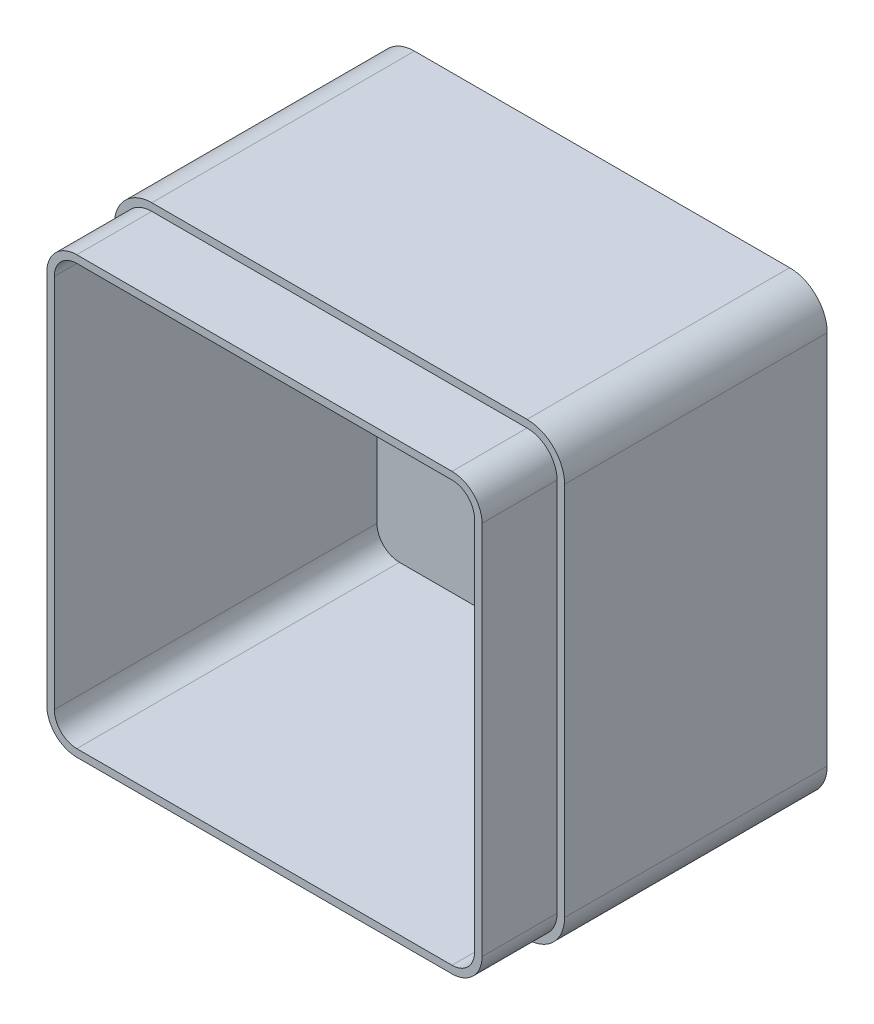
ISO-10303-21;
HEADER;
FILE_DESCRIPTION(('STEP AP214'),'2;1');
FILE_NAME('part.step','',(''),(''),'','','');
FILE_SCHEMA(('AUTOMOTIVE_DESIGN { 1 0 10303 214 1 1 1 1 }'));
ENDSEC;
DATA;
#1=APPLICATION_CONTEXT('core data for automotive mechanical design processes');
#2=APPLICATION_PROTOCOL_DEFINITION('international standard','automotive_design',2000,#1);
#3=PRODUCT_CONTEXT('',#1,'mechanical');
#4=PRODUCT('Part','Part','',(#3));
#5=PRODUCT_RELATED_PRODUCT_CATEGORY('part','',(#4));
#6=PRODUCT_DEFINITION_FORMATION('','',#4);
#7=PRODUCT_DEFINITION_CONTEXT('part definition',#1,'design');
#8=PRODUCT_DEFINITION('design','',#6,#7);
#9=PRODUCT_DEFINITION_SHAPE('','',#8);
#10=(LENGTH_UNIT() NAMED_UNIT(*) SI_UNIT(.MILLI.,.METRE.));
#11=(NAMED_UNIT(*) PLANE_ANGLE_UNIT() SI_UNIT($,.RADIAN.));
#12=(NAMED_UNIT(*) SI_UNIT($,.STERADIAN.) SOLID_ANGLE_UNIT());
#13=UNCERTAINTY_MEASURE_WITH_UNIT(LENGTH_MEASURE(1.E-05),#10,'distance_accuracy_value','');
#14=(GEOMETRIC_REPRESENTATION_CONTEXT(3) GLOBAL_UNCERTAINTY_ASSIGNED_CONTEXT((#13)) GLOBAL_UNIT_ASSIGNED_CONTEXT((#10,
#11,#12)) REPRESENTATION_CONTEXT('',''));
#15=CARTESIAN_POINT('',(0.,0.,0.));
#16=DIRECTION('',(0.,0.,1.));
#17=DIRECTION('',(1.,0.,0.));
#18=AXIS2_PLACEMENT_3D('',#15,#16,#17);
#19=CARTESIAN_POINT('',(0.,0.,90.));
#20=DIRECTION('',(0.,0.,1.));
#21=DIRECTION('',(1.,0.,0.));
#22=AXIS2_PLACEMENT_3D('',#19,#20,#21);
#23=PLANE('',#22);
#24=DIRECTION('',(0.,-1.,0.));
#25=VECTOR('',#24,1.);
#26=CARTESIAN_POINT('',(4.,0.,90.));
#27=LINE('',#26,#25);
#28=CARTESIAN_POINT('',(4.,-10.,90.));
#29=VERTEX_POINT('',#28);
#30=CARTESIAN_POINT('',(4.00000000000001,-110.,90.));
#31=VERTEX_POINT('',#30);
#32=EDGE_CURVE('E350',#29,#31,#27,.T.);
#33=ORIENTED_EDGE('',*,*,#32,.F.);
#34=CARTESIAN_POINT('',(10.,-10.,90.));
#35=DIRECTION('',(0.,0.,1.));
#36=DIRECTION('',(1.,0.,0.));
#37=AXIS2_PLACEMENT_3D('',#34,#35,#36);
#38=CIRCLE('',#37,6.);
#39=CARTESIAN_POINT('',(9.99999999999999,-4.,90.));
#40=VERTEX_POINT('',#39);
#41=EDGE_CURVE('E328',#40,#29,#38,.T.);
#42=ORIENTED_EDGE('',*,*,#41,.F.);
#43=DIRECTION('',(-1.,0.,0.));
#44=VECTOR('',#43,1.);
#45=CARTESIAN_POINT('',(0.,-4.,90.));
#46=LINE('',#45,#44);
#47=CARTESIAN_POINT('',(110.,-4.,90.));
#48=VERTEX_POINT('',#47);
#49=EDGE_CURVE('E364',#48,#40,#46,.T.);
#50=ORIENTED_EDGE('',*,*,#49,.F.);
#51=CARTESIAN_POINT('',(110.,-10.,90.));
#52=DIRECTION('',(0.,0.,1.));
#53=DIRECTION('',(1.,0.,0.));
#54=AXIS2_PLACEMENT_3D('',#51,#52,#53);
#55=CIRCLE('',#54,6.);
#56=CARTESIAN_POINT('',(116.,-9.99999999999999,90.));
#57=VERTEX_POINT('',#56);
#58=EDGE_CURVE('E395',#57,#48,#55,.T.);
#59=ORIENTED_EDGE('',*,*,#58,.F.);
#60=DIRECTION('',(0.,1.,0.));
#61=VECTOR('',#60,1.);
#62=CARTESIAN_POINT('',(116.,0.,90.));
#63=LINE('',#62,#61);
#64=CARTESIAN_POINT('',(116.,-110.,90.));
#65=VERTEX_POINT('',#64);
#66=EDGE_CURVE('E392',#65,#57,#63,.T.);
#67=ORIENTED_EDGE('',*,*,#66,.F.);
#68=CARTESIAN_POINT('',(110.,-110.,90.));
#69=DIRECTION('',(0.,0.,1.));
#70=DIRECTION('',(1.,0.,0.));
#71=AXIS2_PLACEMENT_3D('',#68,#69,#70);
#72=CIRCLE('',#71,6.);
#73=CARTESIAN_POINT('',(110.,-116.,90.));
#74=VERTEX_POINT('',#73);
#75=EDGE_CURVE('E388',#74,#65,#72,.T.);
#76=ORIENTED_EDGE('',*,*,#75,.F.);
#77=DIRECTION('',(1.,0.,0.));
#78=VECTOR('',#77,1.);
#79=CARTESIAN_POINT('',(0.,-116.,90.));
#80=LINE('',#79,#78);
#81=CARTESIAN_POINT('',(10.,-116.,90.));
#82=VERTEX_POINT('',#81);
#83=EDGE_CURVE('E385',#82,#74,#80,.T.);
#84=ORIENTED_EDGE('',*,*,#83,.F.);
#85=CARTESIAN_POINT('',(10.,-110.,90.));
#86=DIRECTION('',(0.,0.,1.));
#87=DIRECTION('',(1.,0.,0.));
#88=AXIS2_PLACEMENT_3D('',#85,#86,#87);
#89=CIRCLE('',#88,6.);
#90=EDGE_CURVE('E373',#31,#82,#89,.T.);
#91=ORIENTED_EDGE('',*,*,#90,.F.);
#92=EDGE_LOOP('',(#33,#42,#50,#59,#67,#76,#84,#91));
#93=FACE_BOUND('',#92,.T.);
#94=DIRECTION('',(-1.,0.,0.));
#95=VECTOR('',#94,1.);
#96=CARTESIAN_POINT('',(110.,-2.,90.));
#97=LINE('',#96,#95);
#98=CARTESIAN_POINT('',(110.,-2.,90.));
#99=VERTEX_POINT('',#98);
#100=CARTESIAN_POINT('',(9.99999999999999,-2.,90.));
#101=VERTEX_POINT('',#100);
#102=EDGE_CURVE('E229',#99,#101,#97,.T.);
#103=ORIENTED_EDGE('',*,*,#102,.T.);
#104=CARTESIAN_POINT('',(10.,-10.,90.));
#105=DIRECTION('',(0.,0.,1.));
#106=DIRECTION('',(1.,0.,0.));
#107=AXIS2_PLACEMENT_3D('',#104,#105,#106);
#108=CIRCLE('',#107,8.);
#109=CARTESIAN_POINT('',(2.,-10.,90.));
#110=VERTEX_POINT('',#109);
#111=EDGE_CURVE('E256',#101,#110,#108,.T.);
#112=ORIENTED_EDGE('',*,*,#111,.T.);
#113=DIRECTION('',(0.,-1.,0.));
#114=VECTOR('',#113,1.);
#115=CARTESIAN_POINT('',(2.,-10.,90.));
#116=LINE('',#115,#114);
#117=CARTESIAN_POINT('',(2.,-110.,90.));
#118=VERTEX_POINT('',#117);
#119=EDGE_CURVE('E206',#110,#118,#116,.T.);
#120=ORIENTED_EDGE('',*,*,#119,.T.);
#121=CARTESIAN_POINT('',(10.,-110.,90.));
#122=DIRECTION('',(0.,0.,1.));
#123=DIRECTION('',(1.,0.,0.));
#124=AXIS2_PLACEMENT_3D('',#121,#122,#123);
#125=CIRCLE('',#124,8.);
#126=CARTESIAN_POINT('',(10.,-118.,90.));
#127=VERTEX_POINT('',#126);
#128=EDGE_CURVE('E55',#118,#127,#125,.T.);
#129=ORIENTED_EDGE('',*,*,#128,.T.);
#130=DIRECTION('',(1.,0.,0.));
#131=VECTOR('',#130,1.);
#132=CARTESIAN_POINT('',(10.,-118.,90.));
#133=LINE('',#132,#131);
#134=CARTESIAN_POINT('',(110.,-118.,90.));
#135=VERTEX_POINT('',#134);
#136=EDGE_CURVE('E263',#127,#135,#133,.T.);
#137=ORIENTED_EDGE('',*,*,#136,.T.);
#138=CARTESIAN_POINT('',(110.,-110.,90.));
#139=DIRECTION('',(0.,0.,1.));
#140=DIRECTION('',(1.,0.,0.));
#141=AXIS2_PLACEMENT_3D('',#138,#139,#140);
#142=CIRCLE('',#141,7.99999999999999);
#143=CARTESIAN_POINT('',(118.,-110.,90.));
#144=VERTEX_POINT('',#143);
#145=EDGE_CURVE('E267',#135,#144,#142,.T.);
#146=ORIENTED_EDGE('',*,*,#145,.T.);
#147=DIRECTION('',(0.,1.,0.));
#148=VECTOR('',#147,1.);
#149=CARTESIAN_POINT('',(118.,-110.,90.));
#150=LINE('',#149,#148);
#151=CARTESIAN_POINT('',(118.,-9.99999999999999,90.));
#152=VERTEX_POINT('',#151);
#153=EDGE_CURVE('E271',#144,#152,#150,.T.);
#154=ORIENTED_EDGE('',*,*,#153,.T.);
#155=CARTESIAN_POINT('',(110.,-10.,90.));
#156=DIRECTION('',(0.,0.,1.));
#157=DIRECTION('',(1.,0.,0.));
#158=AXIS2_PLACEMENT_3D('',#155,#156,#157);
#159=CIRCLE('',#158,7.99999999999999);
#160=EDGE_CURVE('E233',#152,#99,#159,.T.);
#161=ORIENTED_EDGE('',*,*,#160,.T.);
#162=EDGE_LOOP('',(#103,#112,#120,#129,#137,#146,#154,#161));
#163=FACE_BOUND('',#162,.T.);
#164=ADVANCED_FACE('F39',(#93,#163),#23,.T.);
#165=CARTESIAN_POINT('',(4.,0.,90.));
#166=DIRECTION('',(1.,0.,0.));
#167=DIRECTION('',(0.,1.,0.));
#168=AXIS2_PLACEMENT_3D('',#165,#166,#167);
#169=PLANE('',#168);
#170=DIRECTION('',(0.,-1.,0.));
#171=VECTOR('',#170,1.);
#172=CARTESIAN_POINT('',(4.,0.,4.));
#173=LINE('',#172,#171);
#174=CARTESIAN_POINT('',(4.,-10.,4.));
#175=VERTEX_POINT('',#174);
#176=CARTESIAN_POINT('',(4.00000000000001,-110.,4.));
#177=VERTEX_POINT('',#176);
#178=EDGE_CURVE('E320',#175,#177,#173,.T.);
#179=ORIENTED_EDGE('',*,*,#178,.F.);
#180=DIRECTION('',(0.,0.,1.));
#181=VECTOR('',#180,1.);
#182=CARTESIAN_POINT('',(4.,-10.,90.));
#183=LINE('',#182,#181);
#184=EDGE_CURVE('E329',#29,#175,#183,.F.);
#185=ORIENTED_EDGE('',*,*,#184,.F.);
#186=ORIENTED_EDGE('',*,*,#32,.T.);
#187=DIRECTION('',(0.,0.,1.));
#188=VECTOR('',#187,1.);
#189=CARTESIAN_POINT('',(4.00000000000001,-110.,90.));
#190=LINE('',#189,#188);
#191=EDGE_CURVE('E325',#177,#31,#190,.T.);
#192=ORIENTED_EDGE('',*,*,#191,.F.);
#193=EDGE_LOOP('',(#179,#185,#186,#192));
#194=FACE_BOUND('',#193,.T.);
#195=ADVANCED_FACE('F504',(#194),#169,.T.);
#196=CARTESIAN_POINT('',(0.,-116.,90.));
#197=DIRECTION('',(0.,1.,0.));
#198=DIRECTION('',(0.,0.,1.));
#199=AXIS2_PLACEMENT_3D('',#196,#197,#198);
#200=PLANE('',#199);
#201=ORIENTED_EDGE('',*,*,#83,.T.);
#202=DIRECTION('',(0.,0.,1.));
#203=VECTOR('',#202,1.);
#204=CARTESIAN_POINT('',(110.,-116.,90.));
#205=LINE('',#204,#203);
#206=CARTESIAN_POINT('',(110.,-116.,4.));
#207=VERTEX_POINT('',#206);
#208=EDGE_CURVE('E361',#207,#74,#205,.T.);
#209=ORIENTED_EDGE('',*,*,#208,.F.);
#210=DIRECTION('',(1.,0.,0.));
#211=VECTOR('',#210,1.);
#212=CARTESIAN_POINT('',(0.,-116.,4.));
#213=LINE('',#212,#211);
#214=CARTESIAN_POINT('',(10.,-116.,4.));
#215=VERTEX_POINT('',#214);
#216=EDGE_CURVE('E324',#215,#207,#213,.T.);
#217=ORIENTED_EDGE('',*,*,#216,.F.);
#218=DIRECTION('',(0.,0.,1.));
#219=VECTOR('',#218,1.);
#220=CARTESIAN_POINT('',(10.,-116.,90.));
#221=LINE('',#220,#219);
#222=EDGE_CURVE('E345',#82,#215,#221,.F.);
#223=ORIENTED_EDGE('',*,*,#222,.F.);
#224=EDGE_LOOP('',(#201,#209,#217,#223));
#225=FACE_BOUND('',#224,.T.);
#226=ADVANCED_FACE('F509',(#225),#200,.T.);
#227=CARTESIAN_POINT('',(116.,0.,90.));
#228=DIRECTION('',(-1.,0.,0.));
#229=DIRECTION('',(0.,0.,1.));
#230=AXIS2_PLACEMENT_3D('',#227,#228,#229);
#231=PLANE('',#230);
#232=ORIENTED_EDGE('',*,*,#66,.T.);
#233=DIRECTION('',(0.,0.,1.));
#234=VECTOR('',#233,1.);
#235=CARTESIAN_POINT('',(116.,-9.99999999999999,90.));
#236=LINE('',#235,#234);
#237=CARTESIAN_POINT('',(116.,-9.99999999999999,4.));
#238=VERTEX_POINT('',#237);
#239=EDGE_CURVE('E370',#238,#57,#236,.T.);
#240=ORIENTED_EDGE('',*,*,#239,.F.);
#241=DIRECTION('',(0.,1.,0.));
#242=VECTOR('',#241,1.);
#243=CARTESIAN_POINT('',(116.,0.,4.));
#244=LINE('',#243,#242);
#245=CARTESIAN_POINT('',(116.,-110.,4.));
#246=VERTEX_POINT('',#245);
#247=EDGE_CURVE('E337',#246,#238,#244,.T.);
#248=ORIENTED_EDGE('',*,*,#247,.F.);
#249=DIRECTION('',(0.,0.,1.));
#250=VECTOR('',#249,1.);
#251=CARTESIAN_POINT('',(116.,-110.,90.));
#252=LINE('',#251,#250);
#253=EDGE_CURVE('E365',#65,#246,#252,.F.);
#254=ORIENTED_EDGE('',*,*,#253,.F.);
#255=EDGE_LOOP('',(#232,#240,#248,#254));
#256=FACE_BOUND('',#255,.T.);
#257=ADVANCED_FACE('F538',(#256),#231,.T.);
#258=CARTESIAN_POINT('',(0.,-4.,90.));
#259=DIRECTION('',(0.,-1.,0.));
#260=DIRECTION('',(0.,0.,-1.));
#261=AXIS2_PLACEMENT_3D('',#258,#259,#260);
#262=PLANE('',#261);
#263=ORIENTED_EDGE('',*,*,#49,.T.);
#264=DIRECTION('',(0.,0.,-1.));
#265=VECTOR('',#264,1.);
#266=CARTESIAN_POINT('',(9.99999999999999,-4.,90.));
#267=LINE('',#266,#265);
#268=CARTESIAN_POINT('',(9.99999999999999,-4.,4.));
#269=VERTEX_POINT('',#268);
#270=EDGE_CURVE('E369',#269,#40,#267,.F.);
#271=ORIENTED_EDGE('',*,*,#270,.F.);
#272=DIRECTION('',(-1.,0.,0.));
#273=VECTOR('',#272,1.);
#274=CARTESIAN_POINT('',(0.,-4.,4.));
#275=LINE('',#274,#273);
#276=CARTESIAN_POINT('',(110.,-4.,4.));
#277=VERTEX_POINT('',#276);
#278=EDGE_CURVE('E346',#277,#269,#275,.T.);
#279=ORIENTED_EDGE('',*,*,#278,.F.);
#280=DIRECTION('',(0.,0.,-1.));
#281=VECTOR('',#280,1.);
#282=CARTESIAN_POINT('',(110.,-4.,90.));
#283=LINE('',#282,#281);
#284=EDGE_CURVE('E374',#48,#277,#283,.T.);
#285=ORIENTED_EDGE('',*,*,#284,.F.);
#286=EDGE_LOOP('',(#263,#271,#279,#285));
#287=FACE_BOUND('',#286,.T.);
#288=ADVANCED_FACE('F534',(#287),#262,.T.);
#289=CARTESIAN_POINT('',(0.,0.,4.));
#290=DIRECTION('',(0.,0.,1.));
#291=DIRECTION('',(1.,0.,0.));
#292=AXIS2_PLACEMENT_3D('',#289,#290,#291);
#293=PLANE('',#292);
#294=ORIENTED_EDGE('',*,*,#216,.T.);
#295=CARTESIAN_POINT('',(110.,-110.,4.));
#296=DIRECTION('',(0.,0.,1.));
#297=DIRECTION('',(1.,0.,0.));
#298=AXIS2_PLACEMENT_3D('',#295,#296,#297);
#299=CIRCLE('',#298,6.);
#300=EDGE_CURVE('E340',#246,#207,#299,.F.);
#301=ORIENTED_EDGE('',*,*,#300,.F.);
#302=ORIENTED_EDGE('',*,*,#247,.T.);
#303=CARTESIAN_POINT('',(110.,-10.,4.));
#304=DIRECTION('',(0.,0.,1.));
#305=DIRECTION('',(1.,0.,0.));
#306=AXIS2_PLACEMENT_3D('',#303,#304,#305);
#307=CIRCLE('',#306,6.);
#308=EDGE_CURVE('E344',#277,#238,#307,.F.);
#309=ORIENTED_EDGE('',*,*,#308,.F.);
#310=ORIENTED_EDGE('',*,*,#278,.T.);
#311=CARTESIAN_POINT('',(10.,-10.,4.));
#312=DIRECTION('',(0.,0.,1.));
#313=DIRECTION('',(1.,0.,0.));
#314=AXIS2_PLACEMENT_3D('',#311,#312,#313);
#315=CIRCLE('',#314,6.);
#316=EDGE_CURVE('E341',#175,#269,#315,.F.);
#317=ORIENTED_EDGE('',*,*,#316,.F.);
#318=ORIENTED_EDGE('',*,*,#178,.T.);
#319=CARTESIAN_POINT('',(10.,-110.,4.));
#320=DIRECTION('',(0.,0.,1.));
#321=DIRECTION('',(1.,0.,0.));
#322=AXIS2_PLACEMENT_3D('',#319,#320,#321);
#323=CIRCLE('',#322,6.);
#324=EDGE_CURVE('E333',#215,#177,#323,.F.);
#325=ORIENTED_EDGE('',*,*,#324,.F.);
#326=EDGE_LOOP('',(#294,#301,#302,#309,#310,#317,#318,#325));
#327=FACE_BOUND('',#326,.T.);
#328=ADVANCED_FACE('F530',(#327),#293,.T.);
#329=CARTESIAN_POINT('',(10.,-110.,90.));
#330=DIRECTION('',(0.,0.,-1.));
#331=DIRECTION('',(-1.,0.,0.));
#332=AXIS2_PLACEMENT_3D('',#329,#330,#331);
#333=CYLINDRICAL_SURFACE('',#332,6.);
#334=ORIENTED_EDGE('',*,*,#90,.T.);
#335=ORIENTED_EDGE('',*,*,#222,.T.);
#336=ORIENTED_EDGE('',*,*,#324,.T.);
#337=ORIENTED_EDGE('',*,*,#191,.T.);
#338=EDGE_LOOP('',(#334,#335,#336,#337));
#339=FACE_BOUND('',#338,.T.);
#340=ADVANCED_FACE('F526',(#339),#333,.F.);
#341=CARTESIAN_POINT('',(110.,-110.,90.));
#342=DIRECTION('',(0.,0.,-1.));
#343=DIRECTION('',(-1.,0.,0.));
#344=AXIS2_PLACEMENT_3D('',#341,#342,#343);
#345=CYLINDRICAL_SURFACE('',#344,6.);
#346=ORIENTED_EDGE('',*,*,#75,.T.);
#347=ORIENTED_EDGE('',*,*,#253,.T.);
#348=ORIENTED_EDGE('',*,*,#300,.T.);
#349=ORIENTED_EDGE('',*,*,#208,.T.);
#350=EDGE_LOOP('',(#346,#347,#348,#349));
#351=FACE_BOUND('',#350,.T.);
#352=ADVANCED_FACE('F522',(#351),#345,.F.);
#353=CARTESIAN_POINT('',(110.,-10.,90.));
#354=DIRECTION('',(0.,0.,-1.));
#355=DIRECTION('',(-1.,0.,0.));
#356=AXIS2_PLACEMENT_3D('',#353,#354,#355);
#357=CYLINDRICAL_SURFACE('',#356,6.);
#358=ORIENTED_EDGE('',*,*,#58,.T.);
#359=ORIENTED_EDGE('',*,*,#284,.T.);
#360=ORIENTED_EDGE('',*,*,#308,.T.);
#361=ORIENTED_EDGE('',*,*,#239,.T.);
#362=EDGE_LOOP('',(#358,#359,#360,#361));
#363=FACE_BOUND('',#362,.T.);
#364=ADVANCED_FACE('F518',(#363),#357,.F.);
#365=CARTESIAN_POINT('',(10.,-10.,90.));
#366=DIRECTION('',(0.,0.,-1.));
#367=DIRECTION('',(-1.,0.,0.));
#368=AXIS2_PLACEMENT_3D('',#365,#366,#367);
#369=CYLINDRICAL_SURFACE('',#368,6.);
#370=ORIENTED_EDGE('',*,*,#41,.T.);
#371=ORIENTED_EDGE('',*,*,#184,.T.);
#372=ORIENTED_EDGE('',*,*,#316,.T.);
#373=ORIENTED_EDGE('',*,*,#270,.T.);
#374=EDGE_LOOP('',(#370,#371,#372,#373));
#375=FACE_BOUND('',#374,.T.);
#376=ADVANCED_FACE('F515',(#375),#369,.F.);
#377=CARTESIAN_POINT('',(10.,-10.,70.));
#378=DIRECTION('',(0.,0.,1.));
#379=DIRECTION('',(1.,0.,0.));
#380=AXIS2_PLACEMENT_3D('',#377,#378,#379);
#381=PLANE('',#380);
#382=DIRECTION('',(-1.,0.,0.));
#383=VECTOR('',#382,1.);
#384=CARTESIAN_POINT('',(110.,-2.,70.));
#385=LINE('',#384,#383);
#386=CARTESIAN_POINT('',(110.,-2.,70.));
#387=VERTEX_POINT('',#386);
#388=CARTESIAN_POINT('',(9.99999999999999,-2.,70.));
#389=VERTEX_POINT('',#388);
#390=EDGE_CURVE('E213',#387,#389,#385,.T.);
#391=ORIENTED_EDGE('',*,*,#390,.F.);
#392=CARTESIAN_POINT('',(110.,-10.,70.));
#393=DIRECTION('',(0.,0.,1.));
#394=DIRECTION('',(1.,0.,0.));
#395=AXIS2_PLACEMENT_3D('',#392,#393,#394);
#396=CIRCLE('',#395,7.99999999999999);
#397=CARTESIAN_POINT('',(118.,-9.99999999999999,70.));
#398=VERTEX_POINT('',#397);
#399=EDGE_CURVE('E250',#398,#387,#396,.T.);
#400=ORIENTED_EDGE('',*,*,#399,.F.);
#401=DIRECTION('',(0.,1.,0.));
#402=VECTOR('',#401,1.);
#403=CARTESIAN_POINT('',(118.,-110.,70.));
#404=LINE('',#403,#402);
#405=CARTESIAN_POINT('',(118.,-110.,70.));
#406=VERTEX_POINT('',#405);
#407=EDGE_CURVE('E246',#406,#398,#404,.T.);
#408=ORIENTED_EDGE('',*,*,#407,.F.);
#409=CARTESIAN_POINT('',(110.,-110.,70.));
#410=DIRECTION('',(0.,0.,1.));
#411=DIRECTION('',(1.,0.,0.));
#412=AXIS2_PLACEMENT_3D('',#409,#410,#411);
#413=CIRCLE('',#412,7.99999999999999);
#414=CARTESIAN_POINT('',(110.,-118.,70.));
#415=VERTEX_POINT('',#414);
#416=EDGE_CURVE('E242',#415,#406,#413,.T.);
#417=ORIENTED_EDGE('',*,*,#416,.F.);
#418=DIRECTION('',(1.,0.,0.));
#419=VECTOR('',#418,1.);
#420=CARTESIAN_POINT('',(10.,-118.,70.));
#421=LINE('',#420,#419);
#422=CARTESIAN_POINT('',(10.,-118.,70.));
#423=VERTEX_POINT('',#422);
#424=EDGE_CURVE('E238',#423,#415,#421,.T.);
#425=ORIENTED_EDGE('',*,*,#424,.F.);
#426=CARTESIAN_POINT('',(10.,-110.,70.));
#427=DIRECTION('',(0.,0.,1.));
#428=DIRECTION('',(1.,0.,0.));
#429=AXIS2_PLACEMENT_3D('',#426,#427,#428);
#430=CIRCLE('',#429,8.);
#431=CARTESIAN_POINT('',(2.,-110.,70.));
#432=VERTEX_POINT('',#431);
#433=EDGE_CURVE('E223',#432,#423,#430,.T.);
#434=ORIENTED_EDGE('',*,*,#433,.F.);
#435=DIRECTION('',(0.,-1.,0.));
#436=VECTOR('',#435,1.);
#437=CARTESIAN_POINT('',(2.,-10.,70.));
#438=LINE('',#437,#436);
#439=CARTESIAN_POINT('',(2.,-10.,70.));
#440=VERTEX_POINT('',#439);
#441=EDGE_CURVE('E204',#440,#432,#438,.T.);
#442=ORIENTED_EDGE('',*,*,#441,.F.);
#443=CARTESIAN_POINT('',(10.,-10.,70.));
#444=DIRECTION('',(0.,0.,1.));
#445=DIRECTION('',(1.,0.,0.));
#446=AXIS2_PLACEMENT_3D('',#443,#444,#445);
#447=CIRCLE('',#446,8.);
#448=EDGE_CURVE('E219',#389,#440,#447,.T.);
#449=ORIENTED_EDGE('',*,*,#448,.F.);
#450=EDGE_LOOP('',(#391,#400,#408,#417,#425,#434,#442,#449));
#451=FACE_BOUND('',#450,.T.);
#452=CARTESIAN_POINT('',(10.,-10.,70.));
#453=DIRECTION('',(0.,0.,1.));
#454=DIRECTION('',(1.,0.,0.));
#455=AXIS2_PLACEMENT_3D('',#452,#453,#454);
#456=CIRCLE('',#455,10.);
#457=CARTESIAN_POINT('',(10.,0.,70.));
#458=VERTEX_POINT('',#457);
#459=CARTESIAN_POINT('',(0.,-10.,70.));
#460=VERTEX_POINT('',#459);
#461=EDGE_CURVE('E280',#458,#460,#456,.T.);
#462=ORIENTED_EDGE('',*,*,#461,.T.);
#463=DIRECTION('',(0.,-1.,0.));
#464=VECTOR('',#463,1.);
#465=CARTESIAN_POINT('',(0.,-10.,70.));
#466=LINE('',#465,#464);
#467=CARTESIAN_POINT('',(0.,-110.,70.));
#468=VERTEX_POINT('',#467);
#469=EDGE_CURVE('E300',#460,#468,#466,.T.);
#470=ORIENTED_EDGE('',*,*,#469,.T.);
#471=CARTESIAN_POINT('',(10.,-110.,70.));
#472=DIRECTION('',(0.,0.,1.));
#473=DIRECTION('',(1.,0.,0.));
#474=AXIS2_PLACEMENT_3D('',#471,#472,#473);
#475=CIRCLE('',#474,9.99999999999999);
#476=CARTESIAN_POINT('',(10.,-120.,70.));
#477=VERTEX_POINT('',#476);
#478=EDGE_CURVE('E303',#468,#477,#475,.T.);
#479=ORIENTED_EDGE('',*,*,#478,.T.);
#480=DIRECTION('',(1.,0.,0.));
#481=VECTOR('',#480,1.);
#482=CARTESIAN_POINT('',(10.,-120.,70.));
#483=LINE('',#482,#481);
#484=CARTESIAN_POINT('',(110.,-120.,70.));
#485=VERTEX_POINT('',#484);
#486=EDGE_CURVE('E306',#477,#485,#483,.T.);
#487=ORIENTED_EDGE('',*,*,#486,.T.);
#488=CARTESIAN_POINT('',(110.,-110.,70.));
#489=DIRECTION('',(0.,0.,1.));
#490=DIRECTION('',(1.,0.,0.));
#491=AXIS2_PLACEMENT_3D('',#488,#489,#490);
#492=CIRCLE('',#491,9.99999999999999);
#493=CARTESIAN_POINT('',(120.,-110.,70.));
#494=VERTEX_POINT('',#493);
#495=EDGE_CURVE('E309',#485,#494,#492,.T.);
#496=ORIENTED_EDGE('',*,*,#495,.T.);
#497=DIRECTION('',(0.,1.,0.));
#498=VECTOR('',#497,1.);
#499=CARTESIAN_POINT('',(120.,-110.,70.));
#500=LINE('',#499,#498);
#501=CARTESIAN_POINT('',(120.,-10.,70.));
#502=VERTEX_POINT('',#501);
#503=EDGE_CURVE('E312',#494,#502,#500,.T.);
#504=ORIENTED_EDGE('',*,*,#503,.T.);
#505=CARTESIAN_POINT('',(110.,-10.,70.));
#506=DIRECTION('',(0.,0.,1.));
#507=DIRECTION('',(1.,0.,0.));
#508=AXIS2_PLACEMENT_3D('',#505,#506,#507);
#509=CIRCLE('',#508,9.99999999999999);
#510=CARTESIAN_POINT('',(110.,0.,70.));
#511=VERTEX_POINT('',#510);
#512=EDGE_CURVE('E315',#502,#511,#509,.T.);
#513=ORIENTED_EDGE('',*,*,#512,.T.);
#514=DIRECTION('',(-1.,0.,0.));
#515=VECTOR('',#514,1.);
#516=CARTESIAN_POINT('',(110.,0.,70.));
#517=LINE('',#516,#515);
#518=EDGE_CURVE('E63',#511,#458,#517,.T.);
#519=ORIENTED_EDGE('',*,*,#518,.T.);
#520=EDGE_LOOP('',(#462,#470,#479,#487,#496,#504,#513,#519));
#521=FACE_BOUND('',#520,.T.);
#522=ADVANCED_FACE('F218',(#451,#521),#381,.T.);
#523=CARTESIAN_POINT('',(10.,-10.,70.));
#524=DIRECTION('',(0.,0.,1.));
#525=DIRECTION('',(1.,0.,0.));
#526=AXIS2_PLACEMENT_3D('',#523,#524,#525);
#527=CYLINDRICAL_SURFACE('',#526,8.);
#528=ORIENTED_EDGE('',*,*,#111,.F.);
#529=DIRECTION('',(0.,0.,1.));
#530=VECTOR('',#529,1.);
#531=CARTESIAN_POINT('',(9.99999999999999,-2.,70.));
#532=LINE('',#531,#530);
#533=EDGE_CURVE('E227',#389,#101,#532,.T.);
#534=ORIENTED_EDGE('',*,*,#533,.F.);
#535=ORIENTED_EDGE('',*,*,#448,.T.);
#536=DIRECTION('',(0.,0.,1.));
#537=VECTOR('',#536,1.);
#538=CARTESIAN_POINT('',(2.,-10.,70.));
#539=LINE('',#538,#537);
#540=EDGE_CURVE('E201',#440,#110,#539,.T.);
#541=ORIENTED_EDGE('',*,*,#540,.T.);
#542=EDGE_LOOP('',(#528,#534,#535,#541));
#543=FACE_BOUND('',#542,.T.);
#544=ADVANCED_FACE('F226',(#543),#527,.T.);
#545=CARTESIAN_POINT('',(110.,-2.,70.));
#546=DIRECTION('',(0.,1.,0.));
#547=DIRECTION('',(-1.,0.,0.));
#548=AXIS2_PLACEMENT_3D('',#545,#546,#547);
#549=PLANE('',#548);
#550=ORIENTED_EDGE('',*,*,#102,.F.);
#551=DIRECTION('',(0.,0.,1.));
#552=VECTOR('',#551,1.);
#553=CARTESIAN_POINT('',(110.,-2.,70.));
#554=LINE('',#553,#552);
#555=EDGE_CURVE('E281',#387,#99,#554,.T.);
#556=ORIENTED_EDGE('',*,*,#555,.F.);
#557=ORIENTED_EDGE('',*,*,#390,.T.);
#558=ORIENTED_EDGE('',*,*,#533,.T.);
#559=EDGE_LOOP('',(#550,#556,#557,#558));
#560=FACE_BOUND('',#559,.T.);
#561=ADVANCED_FACE('F549',(#560),#549,.T.);
#562=CARTESIAN_POINT('',(110.,-10.,70.));
#563=DIRECTION('',(0.,0.,1.));
#564=DIRECTION('',(1.,0.,0.));
#565=AXIS2_PLACEMENT_3D('',#562,#563,#564);
#566=CYLINDRICAL_SURFACE('',#565,7.99999999999999);
#567=ORIENTED_EDGE('',*,*,#160,.F.);
#568=DIRECTION('',(0.,0.,1.));
#569=VECTOR('',#568,1.);
#570=CARTESIAN_POINT('',(118.,-9.99999999999999,70.));
#571=LINE('',#570,#569);
#572=EDGE_CURVE('E284',#398,#152,#571,.T.);
#573=ORIENTED_EDGE('',*,*,#572,.F.);
#574=ORIENTED_EDGE('',*,*,#399,.T.);
#575=ORIENTED_EDGE('',*,*,#555,.T.);
#576=EDGE_LOOP('',(#567,#573,#574,#575));
#577=FACE_BOUND('',#576,.T.);
#578=ADVANCED_FACE('F564',(#577),#566,.T.);
#579=CARTESIAN_POINT('',(118.,-110.,70.));
#580=DIRECTION('',(1.,0.,0.));
#581=DIRECTION('',(0.,0.,-1.));
#582=AXIS2_PLACEMENT_3D('',#579,#580,#581);
#583=PLANE('',#582);
#584=ORIENTED_EDGE('',*,*,#153,.F.);
#585=DIRECTION('',(0.,0.,1.));
#586=VECTOR('',#585,1.);
#587=CARTESIAN_POINT('',(118.,-110.,70.));
#588=LINE('',#587,#586);
#589=EDGE_CURVE('E287',#406,#144,#588,.T.);
#590=ORIENTED_EDGE('',*,*,#589,.F.);
#591=ORIENTED_EDGE('',*,*,#407,.T.);
#592=ORIENTED_EDGE('',*,*,#572,.T.);
#593=EDGE_LOOP('',(#584,#590,#591,#592));
#594=FACE_BOUND('',#593,.T.);
#595=ADVANCED_FACE('F560',(#594),#583,.T.);
#596=CARTESIAN_POINT('',(110.,-110.,70.));
#597=DIRECTION('',(0.,0.,1.));
#598=DIRECTION('',(1.,0.,0.));
#599=AXIS2_PLACEMENT_3D('',#596,#597,#598);
#600=CYLINDRICAL_SURFACE('',#599,7.99999999999999);
#601=ORIENTED_EDGE('',*,*,#145,.F.);
#602=DIRECTION('',(0.,0.,1.));
#603=VECTOR('',#602,1.);
#604=CARTESIAN_POINT('',(110.,-118.,70.));
#605=LINE('',#604,#603);
#606=EDGE_CURVE('E290',#415,#135,#605,.T.);
#607=ORIENTED_EDGE('',*,*,#606,.F.);
#608=ORIENTED_EDGE('',*,*,#416,.T.);
#609=ORIENTED_EDGE('',*,*,#589,.T.);
#610=EDGE_LOOP('',(#601,#607,#608,#609));
#611=FACE_BOUND('',#610,.T.);
#612=ADVANCED_FACE('F556',(#611),#600,.T.);
#613=CARTESIAN_POINT('',(10.,-118.,70.));
#614=DIRECTION('',(0.,-1.,0.));
#615=DIRECTION('',(0.,0.,-1.));
#616=AXIS2_PLACEMENT_3D('',#613,#614,#615);
#617=PLANE('',#616);
#618=ORIENTED_EDGE('',*,*,#136,.F.);
#619=DIRECTION('',(0.,0.,1.));
#620=VECTOR('',#619,1.);
#621=CARTESIAN_POINT('',(10.,-118.,70.));
#622=LINE('',#621,#620);
#623=EDGE_CURVE('E293',#423,#127,#622,.T.);
#624=ORIENTED_EDGE('',*,*,#623,.F.);
#625=ORIENTED_EDGE('',*,*,#424,.T.);
#626=ORIENTED_EDGE('',*,*,#606,.T.);
#627=EDGE_LOOP('',(#618,#624,#625,#626));
#628=FACE_BOUND('',#627,.T.);
#629=ADVANCED_FACE('F553',(#628),#617,.T.);
#630=CARTESIAN_POINT('',(10.,-110.,70.));
#631=DIRECTION('',(0.,0.,1.));
#632=DIRECTION('',(1.,0.,0.));
#633=AXIS2_PLACEMENT_3D('',#630,#631,#632);
#634=CYLINDRICAL_SURFACE('',#633,8.);
#635=ORIENTED_EDGE('',*,*,#128,.F.);
#636=DIRECTION('',(0.,0.,1.));
#637=VECTOR('',#636,1.);
#638=CARTESIAN_POINT('',(2.,-110.,70.));
#639=LINE('',#638,#637);
#640=EDGE_CURVE('E212',#432,#118,#639,.T.);
#641=ORIENTED_EDGE('',*,*,#640,.F.);
#642=ORIENTED_EDGE('',*,*,#433,.T.);
#643=ORIENTED_EDGE('',*,*,#623,.T.);
#644=EDGE_LOOP('',(#635,#641,#642,#643));
#645=FACE_BOUND('',#644,.T.);
#646=ADVANCED_FACE('F499',(#645),#634,.T.);
#647=CARTESIAN_POINT('',(2.,-10.,70.));
#648=DIRECTION('',(-1.,0.,0.));
#649=DIRECTION('',(0.,0.,1.));
#650=AXIS2_PLACEMENT_3D('',#647,#648,#649);
#651=PLANE('',#650);
#652=ORIENTED_EDGE('',*,*,#119,.F.);
#653=ORIENTED_EDGE('',*,*,#540,.F.);
#654=ORIENTED_EDGE('',*,*,#441,.T.);
#655=ORIENTED_EDGE('',*,*,#640,.T.);
#656=EDGE_LOOP('',(#652,#653,#654,#655));
#657=FACE_BOUND('',#656,.T.);
#658=ADVANCED_FACE('F203',(#657),#651,.T.);
#659=CARTESIAN_POINT('',(0.,0.,0.));
#660=DIRECTION('',(0.,0.,1.));
#661=DIRECTION('',(1.,0.,0.));
#662=AXIS2_PLACEMENT_3D('',#659,#660,#661);
#663=PLANE('',#662);
#664=DIRECTION('',(1.,0.,0.));
#665=VECTOR('',#664,1.);
#666=CARTESIAN_POINT('',(0.,-120.,0.));
#667=LINE('',#666,#665);
#668=CARTESIAN_POINT('',(10.,-120.,0.));
#669=VERTEX_POINT('',#668);
#670=CARTESIAN_POINT('',(110.,-120.,0.));
#671=VERTEX_POINT('',#670);
#672=EDGE_CURVE('E408',#669,#671,#667,.T.);
#673=ORIENTED_EDGE('',*,*,#672,.F.);
#674=CARTESIAN_POINT('',(10.,-110.,0.));
#675=DIRECTION('',(0.,0.,1.));
#676=DIRECTION('',(1.,0.,0.));
#677=AXIS2_PLACEMENT_3D('',#674,#675,#676);
#678=CIRCLE('',#677,10.);
#679=CARTESIAN_POINT('',(0.,-110.,0.));
#680=VERTEX_POINT('',#679);
#681=EDGE_CURVE('E436',#669,#680,#678,.F.);
#682=ORIENTED_EDGE('',*,*,#681,.T.);
#683=DIRECTION('',(0.,-1.,0.));
#684=VECTOR('',#683,1.);
#685=CARTESIAN_POINT('',(0.,0.,0.));
#686=LINE('',#685,#684);
#687=CARTESIAN_POINT('',(0.,-10.,0.));
#688=VERTEX_POINT('',#687);
#689=EDGE_CURVE('E378',#688,#680,#686,.T.);
#690=ORIENTED_EDGE('',*,*,#689,.F.);
#691=CARTESIAN_POINT('',(10.,-10.,0.));
#692=DIRECTION('',(0.,0.,1.));
#693=DIRECTION('',(1.,0.,0.));
#694=AXIS2_PLACEMENT_3D('',#691,#692,#693);
#695=CIRCLE('',#694,10.);
#696=CARTESIAN_POINT('',(10.,0.,0.));
#697=VERTEX_POINT('',#696);
#698=EDGE_CURVE('E427',#688,#697,#695,.F.);
#699=ORIENTED_EDGE('',*,*,#698,.T.);
#700=DIRECTION('',(-1.,0.,0.));
#701=VECTOR('',#700,1.);
#702=CARTESIAN_POINT('',(0.,0.,0.));
#703=LINE('',#702,#701);
#704=CARTESIAN_POINT('',(110.,0.,0.));
#705=VERTEX_POINT('',#704);
#706=EDGE_CURVE('E416',#705,#697,#703,.T.);
#707=ORIENTED_EDGE('',*,*,#706,.F.);
#708=CARTESIAN_POINT('',(110.,-10.,0.));
#709=DIRECTION('',(0.,0.,1.));
#710=DIRECTION('',(1.,0.,0.));
#711=AXIS2_PLACEMENT_3D('',#708,#709,#710);
#712=CIRCLE('',#711,10.);
#713=CARTESIAN_POINT('',(120.,-10.,0.));
#714=VERTEX_POINT('',#713);
#715=EDGE_CURVE('E430',#705,#714,#712,.F.);
#716=ORIENTED_EDGE('',*,*,#715,.T.);
#717=DIRECTION('',(0.,1.,0.));
#718=VECTOR('',#717,1.);
#719=CARTESIAN_POINT('',(120.,0.,0.));
#720=LINE('',#719,#718);
#721=CARTESIAN_POINT('',(120.,-110.,0.));
#722=VERTEX_POINT('',#721);
#723=EDGE_CURVE('E412',#722,#714,#720,.T.);
#724=ORIENTED_EDGE('',*,*,#723,.F.);
#725=CARTESIAN_POINT('',(110.,-110.,0.));
#726=DIRECTION('',(0.,0.,1.));
#727=DIRECTION('',(1.,0.,0.));
#728=AXIS2_PLACEMENT_3D('',#725,#726,#727);
#729=CIRCLE('',#728,10.);
#730=EDGE_CURVE('E433',#722,#671,#729,.F.);
#731=ORIENTED_EDGE('',*,*,#730,.T.);
#732=EDGE_LOOP('',(#673,#682,#690,#699,#707,#716,#724,#731));
#733=FACE_BOUND('',#732,.T.);
#734=ADVANCED_FACE('F492',(#733),#663,.F.);
#735=CARTESIAN_POINT('',(10.,-10.,90.));
#736=DIRECTION('',(0.,0.,-1.));
#737=DIRECTION('',(-1.,0.,0.));
#738=AXIS2_PLACEMENT_3D('',#735,#736,#737);
#739=CYLINDRICAL_SURFACE('',#738,10.);
#740=DIRECTION('',(0.,0.,-1.));
#741=VECTOR('',#740,1.);
#742=CARTESIAN_POINT('',(0.,-10.,90.));
#743=LINE('',#742,#741);
#744=EDGE_CURVE('E439',#460,#688,#743,.T.);
#745=ORIENTED_EDGE('',*,*,#744,.F.);
#746=ORIENTED_EDGE('',*,*,#461,.F.);
#747=DIRECTION('',(0.,0.,-1.));
#748=VECTOR('',#747,1.);
#749=CARTESIAN_POINT('',(10.,0.,90.));
#750=LINE('',#749,#748);
#751=EDGE_CURVE('E48',#697,#458,#750,.F.);
#752=ORIENTED_EDGE('',*,*,#751,.F.);
#753=ORIENTED_EDGE('',*,*,#698,.F.);
#754=EDGE_LOOP('',(#745,#746,#752,#753));
#755=FACE_BOUND('',#754,.T.);
#756=ADVANCED_FACE('F41',(#755),#739,.T.);
#757=CARTESIAN_POINT('',(110.,-10.,90.));
#758=DIRECTION('',(0.,0.,-1.));
#759=DIRECTION('',(-1.,0.,0.));
#760=AXIS2_PLACEMENT_3D('',#757,#758,#759);
#761=CYLINDRICAL_SURFACE('',#760,10.);
#762=DIRECTION('',(0.,0.,-1.));
#763=VECTOR('',#762,1.);
#764=CARTESIAN_POINT('',(110.,0.,90.));
#765=LINE('',#764,#763);
#766=EDGE_CURVE('E11',#511,#705,#765,.T.);
#767=ORIENTED_EDGE('',*,*,#766,.F.);
#768=ORIENTED_EDGE('',*,*,#512,.F.);
#769=DIRECTION('',(0.,0.,-1.));
#770=VECTOR('',#769,1.);
#771=CARTESIAN_POINT('',(120.,-10.,90.));
#772=LINE('',#771,#770);
#773=EDGE_CURVE('E446',#714,#502,#772,.F.);
#774=ORIENTED_EDGE('',*,*,#773,.F.);
#775=ORIENTED_EDGE('',*,*,#715,.F.);
#776=EDGE_LOOP('',(#767,#768,#774,#775));
#777=FACE_BOUND('',#776,.T.);
#778=ADVANCED_FACE('F490',(#777),#761,.T.);
#779=CARTESIAN_POINT('',(0.,0.,90.));
#780=DIRECTION('',(0.,-1.,0.));
#781=DIRECTION('',(0.,0.,-1.));
#782=AXIS2_PLACEMENT_3D('',#779,#780,#781);
#783=PLANE('',#782);
#784=ORIENTED_EDGE('',*,*,#518,.F.);
#785=ORIENTED_EDGE('',*,*,#766,.T.);
#786=ORIENTED_EDGE('',*,*,#706,.T.);
#787=ORIENTED_EDGE('',*,*,#751,.T.);
#788=EDGE_LOOP('',(#784,#785,#786,#787));
#789=FACE_BOUND('',#788,.T.);
#790=ADVANCED_FACE('F456',(#789),#783,.F.);
#791=CARTESIAN_POINT('',(110.,-110.,90.));
#792=DIRECTION('',(0.,0.,-1.));
#793=DIRECTION('',(-1.,0.,0.));
#794=AXIS2_PLACEMENT_3D('',#791,#792,#793);
#795=CYLINDRICAL_SURFACE('',#794,10.);
#796=DIRECTION('',(0.,0.,-1.));
#797=VECTOR('',#796,1.);
#798=CARTESIAN_POINT('',(120.,-110.,90.));
#799=LINE('',#798,#797);
#800=EDGE_CURVE('E450',#494,#722,#799,.T.);
#801=ORIENTED_EDGE('',*,*,#800,.F.);
#802=ORIENTED_EDGE('',*,*,#495,.F.);
#803=DIRECTION('',(0.,0.,-1.));
#804=VECTOR('',#803,1.);
#805=CARTESIAN_POINT('',(110.,-120.,90.));
#806=LINE('',#805,#804);
#807=EDGE_CURVE('E420',#671,#485,#806,.F.);
#808=ORIENTED_EDGE('',*,*,#807,.F.);
#809=ORIENTED_EDGE('',*,*,#730,.F.);
#810=EDGE_LOOP('',(#801,#802,#808,#809));
#811=FACE_BOUND('',#810,.T.);
#812=ADVANCED_FACE('F481',(#811),#795,.T.);
#813=CARTESIAN_POINT('',(120.,0.,90.));
#814=DIRECTION('',(-1.,0.,0.));
#815=DIRECTION('',(0.,0.,1.));
#816=AXIS2_PLACEMENT_3D('',#813,#814,#815);
#817=PLANE('',#816);
#818=ORIENTED_EDGE('',*,*,#503,.F.);
#819=ORIENTED_EDGE('',*,*,#800,.T.);
#820=ORIENTED_EDGE('',*,*,#723,.T.);
#821=ORIENTED_EDGE('',*,*,#773,.T.);
#822=EDGE_LOOP('',(#818,#819,#820,#821));
#823=FACE_BOUND('',#822,.T.);
#824=ADVANCED_FACE('F486',(#823),#817,.F.);
#825=CARTESIAN_POINT('',(10.,-110.,90.));
#826=DIRECTION('',(0.,0.,-1.));
#827=DIRECTION('',(-1.,0.,0.));
#828=AXIS2_PLACEMENT_3D('',#825,#826,#827);
#829=CYLINDRICAL_SURFACE('',#828,10.);
#830=DIRECTION('',(0.,0.,-1.));
#831=VECTOR('',#830,1.);
#832=CARTESIAN_POINT('',(10.,-120.,90.));
#833=LINE('',#832,#831);
#834=EDGE_CURVE('E424',#477,#669,#833,.T.);
#835=ORIENTED_EDGE('',*,*,#834,.F.);
#836=ORIENTED_EDGE('',*,*,#478,.F.);
#837=DIRECTION('',(0.,0.,-1.));
#838=VECTOR('',#837,1.);
#839=CARTESIAN_POINT('',(0.,-110.,90.));
#840=LINE('',#839,#838);
#841=EDGE_CURVE('E442',#680,#468,#840,.F.);
#842=ORIENTED_EDGE('',*,*,#841,.F.);
#843=ORIENTED_EDGE('',*,*,#681,.F.);
#844=EDGE_LOOP('',(#835,#836,#842,#843));
#845=FACE_BOUND('',#844,.T.);
#846=ADVANCED_FACE('F471',(#845),#829,.T.);
#847=CARTESIAN_POINT('',(0.,-120.,90.));
#848=DIRECTION('',(0.,1.,0.));
#849=DIRECTION('',(0.,0.,1.));
#850=AXIS2_PLACEMENT_3D('',#847,#848,#849);
#851=PLANE('',#850);
#852=ORIENTED_EDGE('',*,*,#486,.F.);
#853=ORIENTED_EDGE('',*,*,#834,.T.);
#854=ORIENTED_EDGE('',*,*,#672,.T.);
#855=ORIENTED_EDGE('',*,*,#807,.T.);
#856=EDGE_LOOP('',(#852,#853,#854,#855));
#857=FACE_BOUND('',#856,.T.);
#858=ADVANCED_FACE('F476',(#857),#851,.F.);
#859=CARTESIAN_POINT('',(0.,0.,90.));
#860=DIRECTION('',(1.,0.,0.));
#861=DIRECTION('',(0.,1.,0.));
#862=AXIS2_PLACEMENT_3D('',#859,#860,#861);
#863=PLANE('',#862);
#864=ORIENTED_EDGE('',*,*,#469,.F.);
#865=ORIENTED_EDGE('',*,*,#744,.T.);
#866=ORIENTED_EDGE('',*,*,#689,.T.);
#867=ORIENTED_EDGE('',*,*,#841,.T.);
#868=EDGE_LOOP('',(#864,#865,#866,#867));
#869=FACE_BOUND('',#868,.T.);
#870=ADVANCED_FACE('F466',(#869),#863,.F.);
#871=CLOSED_SHELL('',(#164,#195,#226,#257,#288,#328,#340,#352,#364,#376,#522,#544,#561,#578,
#595,#612,#629,#646,#658,#734,#756,#778,#790,#812,#824,#846,#858,#870));
#872=MANIFOLD_SOLID_BREP('B2',#871);
#873=ADVANCED_BREP_SHAPE_REPRESENTATION('',(#18,#872),#14);
#874=SHAPE_DEFINITION_REPRESENTATION(#9,#873);
ENDSEC;
END-ISO-10303-21;
